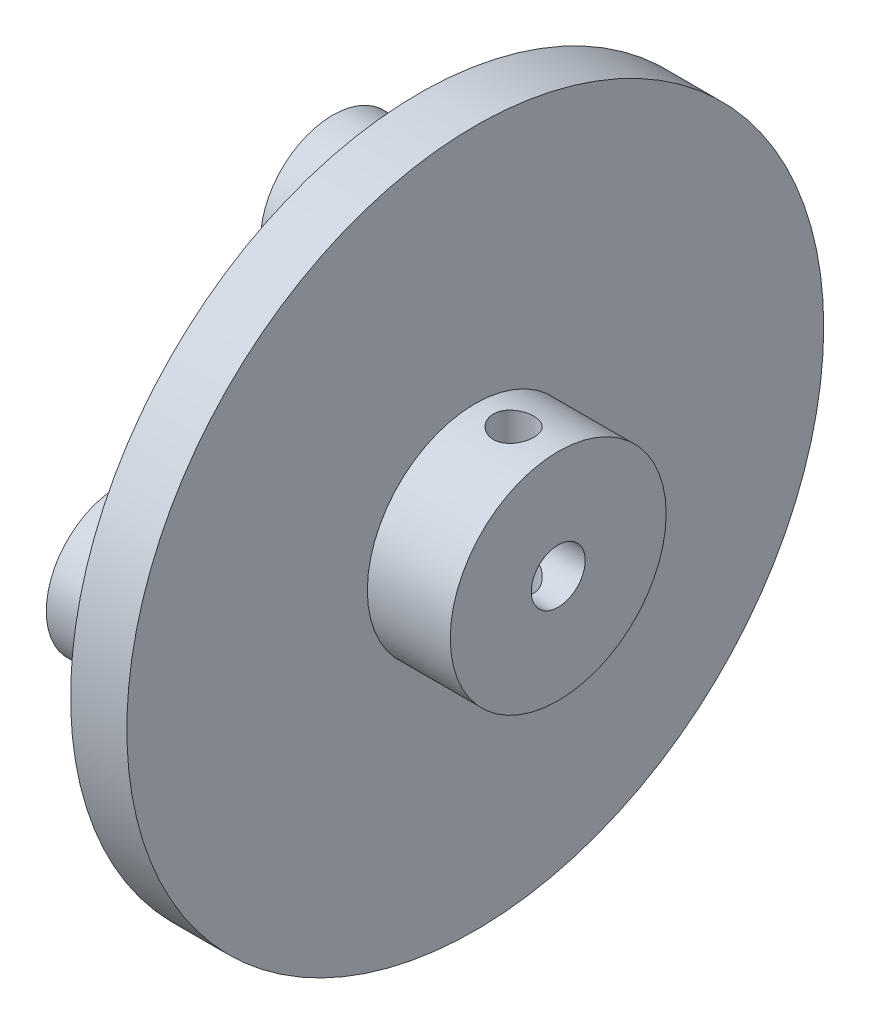
ISO-10303-21;
HEADER;
FILE_DESCRIPTION(('STEP AP214'),'2;1');
FILE_NAME('part.step','',(''),(''),'','','');
FILE_SCHEMA(('AUTOMOTIVE_DESIGN { 1 0 10303 214 1 1 1 1 }'));
ENDSEC;
DATA;
#1=APPLICATION_CONTEXT('core data for automotive mechanical design processes');
#2=APPLICATION_PROTOCOL_DEFINITION('international standard','automotive_design',2000,#1);
#3=PRODUCT_CONTEXT('',#1,'mechanical');
#4=PRODUCT('Part','Part','',(#3));
#5=PRODUCT_RELATED_PRODUCT_CATEGORY('part','',(#4));
#6=PRODUCT_DEFINITION_FORMATION('','',#4);
#7=PRODUCT_DEFINITION_CONTEXT('part definition',#1,'design');
#8=PRODUCT_DEFINITION('design','',#6,#7);
#9=PRODUCT_DEFINITION_SHAPE('','',#8);
#10=(LENGTH_UNIT() NAMED_UNIT(*) SI_UNIT(.MILLI.,.METRE.));
#11=(NAMED_UNIT(*) PLANE_ANGLE_UNIT() SI_UNIT($,.RADIAN.));
#12=(NAMED_UNIT(*) SI_UNIT($,.STERADIAN.) SOLID_ANGLE_UNIT());
#13=UNCERTAINTY_MEASURE_WITH_UNIT(LENGTH_MEASURE(1.E-05),#10,'distance_accuracy_value','');
#14=(GEOMETRIC_REPRESENTATION_CONTEXT(3) GLOBAL_UNCERTAINTY_ASSIGNED_CONTEXT((#13)) GLOBAL_UNIT_ASSIGNED_CONTEXT((#10,
#11,#12)) REPRESENTATION_CONTEXT('',''));
#15=CARTESIAN_POINT('',(0.,0.,0.));
#16=DIRECTION('',(0.,0.,1.));
#17=DIRECTION('',(1.,0.,0.));
#18=AXIS2_PLACEMENT_3D('',#15,#16,#17);
#19=CARTESIAN_POINT('',(-6.42681573579621,0.,0.));
#20=DIRECTION('',(1.,0.,0.));
#21=DIRECTION('',(0.,0.,-1.));
#22=AXIS2_PLACEMENT_3D('',#19,#20,#21);
#23=PLANE('',#22);
#24=CARTESIAN_POINT('',(-6.42681573579621,0.,0.));
#25=DIRECTION('',(1.,0.,0.));
#26=DIRECTION('',(0.,0.,-1.));
#27=AXIS2_PLACEMENT_3D('',#24,#25,#26);
#28=CIRCLE('',#27,4.5);
#29=CARTESIAN_POINT('',(-6.42681573579621,0.,-4.5));
#30=VERTEX_POINT('',#29);
#31=EDGE_CURVE('E127',#30,#30,#28,.T.);
#32=ORIENTED_EDGE('',*,*,#31,.F.);
#33=EDGE_LOOP('',(#32));
#34=FACE_BOUND('',#33,.T.);
#35=CARTESIAN_POINT('',(-6.42681573579621,0.,0.));
#36=DIRECTION('',(1.,0.,0.));
#37=DIRECTION('',(0.,0.,-1.));
#38=AXIS2_PLACEMENT_3D('',#35,#36,#37);
#39=CIRCLE('',#38,1.5875);
#40=CARTESIAN_POINT('',(-6.42681573579621,0.,-1.5875));
#41=VERTEX_POINT('',#40);
#42=EDGE_CURVE('E130',#41,#41,#39,.T.);
#43=ORIENTED_EDGE('',*,*,#42,.T.);
#44=EDGE_LOOP('',(#43));
#45=FACE_BOUND('',#44,.T.);
#46=ADVANCED_FACE('F47',(#34,#45),#23,.F.);
#47=CARTESIAN_POINT('',(0.,0.,0.));
#48=DIRECTION('',(1.,0.,0.));
#49=DIRECTION('',(0.,0.,-1.));
#50=AXIS2_PLACEMENT_3D('',#47,#48,#49);
#51=CYLINDRICAL_SURFACE('',#50,1.5875);
#52=CARTESIAN_POINT('',(-2.62369481915258,-1.05003255157876,1.190625));
#53=CARTESIAN_POINT('',(-2.56813436430848,-1.050045445975,1.19061880120499));
#54=CARTESIAN_POINT('',(-2.51253343816749,-1.05454741000987,1.18668886577821));
#55=CARTESIAN_POINT('',(-2.4035642457863,-1.07148823701036,1.17140301985762));
#56=CARTESIAN_POINT('',(-2.35020314091834,-1.08395075602632,1.16002497361435));
#57=CARTESIAN_POINT('',(-2.24779081580399,-1.11422757784016,1.13096547199778));
#58=CARTESIAN_POINT('',(-2.19869029009737,-1.13196567044321,1.11337314984434));
#59=CARTESIAN_POINT('',(-2.1043081146867,-1.17067373681068,1.0725995764387));
#60=CARTESIAN_POINT('',(-2.05902600431763,-1.1916433198529,1.04941900067592));
#61=CARTESIAN_POINT('',(-1.96320528707628,-1.2396574216291,0.992504284125243));
#62=CARTESIAN_POINT('',(-1.91355214636031,-1.26705442557768,0.957576618231006));
#63=CARTESIAN_POINT('',(-1.82000273032277,-1.321761740015,0.880535424277006));
#64=CARTESIAN_POINT('',(-1.77611510332648,-1.34907186163527,0.838411314369719));
#65=CARTESIAN_POINT('',(-1.6863881953448,-1.40702174808774,0.737878090100433));
#66=CARTESIAN_POINT('',(-1.64198008306869,-1.43720281226121,0.677900035756592));
#67=CARTESIAN_POINT('',(-1.56433844132807,-1.49131980240358,0.548631836139914));
#68=CARTESIAN_POINT('',(-1.53107865803671,-1.51527037067959,0.479364114482457));
#69=CARTESIAN_POINT('',(-1.48608621846711,-1.54808443073509,0.355496037787017));
#70=CARTESIAN_POINT('',(-1.47088637421967,-1.55931958043549,0.30277280194345));
#71=CARTESIAN_POINT('',(-1.44784141458016,-1.57643223525434,0.194907383645005));
#72=CARTESIAN_POINT('',(-1.43998990936785,-1.58231439499439,0.139767346508665));
#73=CARTESIAN_POINT('',(-1.43210006789922,-1.58822529365106,0.0284679172687339));
#74=CARTESIAN_POINT('',(-1.43208203349128,-1.58823882295637,-0.0276937463004202));
#75=CARTESIAN_POINT('',(-1.43991030647193,-1.58237401411808,-0.139157199360017));
#76=CARTESIAN_POINT('',(-1.44775843508592,-1.57649431153499,-0.194458786708893));
#77=CARTESIAN_POINT('',(-1.47044040305828,-1.55965031243376,-0.300743297572917));
#78=CARTESIAN_POINT('',(-1.48502577822232,-1.54886705851508,-0.35180926291256));
#79=CARTESIAN_POINT('',(-1.52037886013472,-1.52306558684007,-0.450596385005578));
#80=CARTESIAN_POINT('',(-1.5411479149349,-1.50804644569141,-0.498316809620449));
#81=CARTESIAN_POINT('',(-1.59065270117417,-1.472890802502,-0.59469093173013));
#82=CARTESIAN_POINT('',(-1.62000754584371,-1.45237629107677,-0.642886211616419));
#83=CARTESIAN_POINT('',(-1.68447719667917,-1.40859432596468,-0.733875255122701));
#84=CARTESIAN_POINT('',(-1.71959691127687,-1.38532453106985,-0.776664360293094));
#85=CARTESIAN_POINT('',(-1.8023408522792,-1.33265676661186,-0.864458871498922));
#86=CARTESIAN_POINT('',(-1.85106587961103,-1.3029537684393,-0.908244413225474));
#87=CARTESIAN_POINT('',(-1.95522601990249,-1.24401229387742,-0.987431949727557));
#88=CARTESIAN_POINT('',(-2.01066431065059,-1.21477404494797,-1.0228299505536));
#89=CARTESIAN_POINT('',(-2.11647417866004,-1.16537919386833,-1.07849357589208));
#90=CARTESIAN_POINT('',(-2.16569078635997,-1.14456844833299,-1.10036663076556));
#91=CARTESIAN_POINT('',(-2.26814663627921,-1.10757288373056,-1.13759771455097));
#92=CARTESIAN_POINT('',(-2.3213764624068,-1.09137763785656,-1.15297046685305));
#93=CARTESIAN_POINT('',(-2.42024633095124,-1.06870540179809,-1.17397518372094));
#94=CARTESIAN_POINT('',(-2.46529969058283,-1.06093847023266,-1.18093386412912));
#95=CARTESIAN_POINT('',(-2.55650822042805,-1.05120748322928,-1.18960709991958));
#96=CARTESIAN_POINT('',(-2.60266190457544,-1.04923600365031,-1.19132836468154));
#97=CARTESIAN_POINT('',(-2.69471876884096,-1.05142402102457,-1.18939683154219));
#98=CARTESIAN_POINT('',(-2.740621850514,-1.05558577464436,-1.1857420555772));
#99=CARTESIAN_POINT('',(-2.8309240151541,-1.06934967402693,-1.17334131022126));
#100=CARTESIAN_POINT('',(-2.87532039377388,-1.0789611050858,-1.16458665082263));
#101=CARTESIAN_POINT('',(-2.9779756423228,-1.10670783140943,-1.13834830402644));
#102=CARTESIAN_POINT('',(-3.03520335757263,-1.12668703809744,-1.11882388129336));
#103=CARTESIAN_POINT('',(-3.14463902716692,-1.1710817723223,-1.07226796784258));
#104=CARTESIAN_POINT('',(-3.19683749850528,-1.19550543916301,-1.04522265503785));
#105=CARTESIAN_POINT('',(-3.29786559429077,-1.24704699135672,-0.983216332051273));
#106=CARTESIAN_POINT('',(-3.34650966465082,-1.27422976552799,-0.948008248603959));
#107=CARTESIAN_POINT('',(-3.43808398313932,-1.32832083103687,-0.870605343134576));
#108=CARTESIAN_POINT('',(-3.48101143699379,-1.3552289822489,-0.828407126793552));
#109=CARTESIAN_POINT('',(-3.56927093125838,-1.41255926707429,-0.727261145352261));
#110=CARTESIAN_POINT('',(-3.61308453999579,-1.44246738243752,-0.666667665064066));
#111=CARTESIAN_POINT('',(-3.6894000263292,-1.49584651911049,-0.536219092541942));
#112=CARTESIAN_POINT('',(-3.72192638616398,-1.519331448665,-0.466384505042537));
#113=CARTESIAN_POINT('',(-3.76545497486353,-1.55114153831889,-0.341912306313172));
#114=CARTESIAN_POINT('',(-3.77999552381496,-1.56190535686026,-0.28912348300368));
#115=CARTESIAN_POINT('',(-3.80172205122167,-1.57805648311366,-0.181264294065453));
#116=CARTESIAN_POINT('',(-3.8089146051317,-1.58344859766149,-0.126196014246041));
#117=CARTESIAN_POINT('',(-3.81552345445215,-1.58840143581668,-0.0151984122151906));
#118=CARTESIAN_POINT('',(-3.81492149542274,-1.58794847048757,0.0407326247410015));
#119=CARTESIAN_POINT('',(-3.80593703230722,-1.58121987574774,0.151613402505127));
#120=CARTESIAN_POINT('',(-3.79755245547226,-1.57494269517078,0.206562877919336));
#121=CARTESIAN_POINT('',(-3.77385847944483,-1.55736449484374,0.312358036108635));
#122=CARTESIAN_POINT('',(-3.75875717522859,-1.54621460816848,0.363276543980958));
#123=CARTESIAN_POINT('',(-3.72241304206754,-1.51973534456514,0.461693691083553));
#124=CARTESIAN_POINT('',(-3.70116889941179,-1.50440507365769,0.509191596064872));
#125=CARTESIAN_POINT('',(-3.65058670618578,-1.46857753504696,0.605272235896158));
#126=CARTESIAN_POINT('',(-3.6206043923859,-1.44769167461642,0.653368356641276));
#127=CARTESIAN_POINT('',(-3.55486958196267,-1.403234954476,0.744073006806096));
#128=CARTESIAN_POINT('',(-3.51911178205677,-1.37966163294053,0.786676427329303));
#129=CARTESIAN_POINT('',(-3.43490305944494,-1.32640667727172,0.874017021494157));
#130=CARTESIAN_POINT('',(-3.38534048959715,-1.29643919738103,0.91750905161459));
#131=CARTESIAN_POINT('',(-3.27943703708205,-1.2371870295527,0.995959824095467));
#132=CARTESIAN_POINT('',(-3.22309368223605,-1.20790259531752,1.03091544004403));
#133=CARTESIAN_POINT('',(-3.11670623899652,-1.15926871150369,1.0850242722053));
#134=CARTESIAN_POINT('',(-3.06792892662924,-1.13913939849812,1.10595986530786));
#135=CARTESIAN_POINT('',(-2.96652900691447,-1.10357098191916,1.14145534685201));
#136=CARTESIAN_POINT('',(-2.91391705144868,-1.08811945745384,1.15603216594685));
#137=CARTESIAN_POINT('',(-2.82150666984751,-1.06785111060464,1.17472664594127));
#138=CARTESIAN_POINT('',(-2.78247095631577,-1.06124478398383,1.18065747665075));
#139=CARTESIAN_POINT('',(-2.70352834230711,-1.05233228217761,1.18860759763756));
#140=CARTESIAN_POINT('',(-2.66362203090349,-1.05002328532472,1.19062945461798));
#141=CARTESIAN_POINT('',(-2.62369481915258,-1.05003255157876,1.190625));
#142=B_SPLINE_CURVE_WITH_KNOTS('',3,(#52,#53,#54,#55,#56,#57,#58,#59,#60,#61,#62,#63,#64,#65,
#66,#67,#68,#69,#70,#71,#72,#73,#74,#75,#76,#77,#78,#79,#80,#81,#82,#83,#84,#85,#86,#87,#88,#89,
#90,#91,#92,#93,#94,#95,#96,#97,#98,#99,#100,#101,#102,#103,#104,#105,#106,#107,#108,#109,#110,
#111,#112,#113,#114,#115,#116,#117,#118,#119,#120,#121,#122,#123,#124,#125,#126,#127,#128,#129,
#130,#131,#132,#133,#134,#135,#136,#137,#138,#139,#140,#141),.UNSPECIFIED.,.T.,.F.,(4,2,2,2,2,2,
2,2,2,2,2,2,2,2,2,2,2,2,2,2,2,2,2,2,2,2,2,2,2,2,2,2,2,2,2,2,2,2,2,2,2,2,2,2,4),(0.,
0.166474597743314,0.333446217300252,0.498114149835985,0.662762187833674,0.861895093986152,
1.0613233713153,1.30147098182183,1.5410490153444,1.70837006939059,1.87554549222377,
2.04315417765197,2.21080167790273,2.37270731241696,2.53464826848756,2.71412370017785,
2.89375274442083,3.10871804281232,3.32378549783047,3.49646406272525,3.66874938249073,
3.80688854402059,3.9448506680219,4.08286356658931,4.22111232464965,4.41110709885653,
4.60145338469826,4.79856172215235,4.99576605498253,5.23599171487224,5.47569301565586,
5.64239486354326,5.80894740496725,5.97589007623953,6.14287722220568,6.30501670074205,
6.46719088019845,6.64773604163628,6.82844793934811,7.0449089208391,7.26144906140521,
7.43123259464913,7.60056126707079,7.72027294583552,7.83990599300724),.UNSPECIFIED.);
#143=CARTESIAN_POINT('',(-2.62369481915258,-1.05003255157876,1.190625));
#144=VERTEX_POINT('',#143);
#145=EDGE_CURVE('E99',#144,#144,#142,.T.);
#146=ORIENTED_EDGE('',*,*,#145,.F.);
#147=EDGE_LOOP('',(#146));
#148=FACE_BOUND('',#147,.T.);
#149=CARTESIAN_POINT('',(-2.62369481915258,1.05003255157876,1.190625));
#150=CARTESIAN_POINT('',(-2.67925527399667,1.050045445975,1.19061880120499));
#151=CARTESIAN_POINT('',(-2.73485620013766,1.05454741000987,1.18668886577821));
#152=CARTESIAN_POINT('',(-2.84382539251885,1.07148823701036,1.17140301985762));
#153=CARTESIAN_POINT('',(-2.89718649738681,1.08395075602632,1.16002497361435));
#154=CARTESIAN_POINT('',(-2.99959882250116,1.11422757784016,1.13096547199778));
#155=CARTESIAN_POINT('',(-3.04869934820778,1.13196567044321,1.11337314984434));
#156=CARTESIAN_POINT('',(-3.14308152361845,1.17067373681068,1.0725995764387));
#157=CARTESIAN_POINT('',(-3.18836363398752,1.1916433198529,1.04941900067592));
#158=CARTESIAN_POINT('',(-3.28418435122887,1.2396574216291,0.992504284125243));
#159=CARTESIAN_POINT('',(-3.33383749194484,1.26705442557768,0.957576618231006));
#160=CARTESIAN_POINT('',(-3.42738690798238,1.321761740015,0.880535424277006));
#161=CARTESIAN_POINT('',(-3.47127453497867,1.34907186163527,0.838411314369719));
#162=CARTESIAN_POINT('',(-3.56100144296035,1.40702174808774,0.737878090100432));
#163=CARTESIAN_POINT('',(-3.60540955523646,1.43720281226121,0.677900035756592));
#164=CARTESIAN_POINT('',(-3.68305119697708,1.49131980240358,0.548631836139914));
#165=CARTESIAN_POINT('',(-3.71631098026844,1.51527037067959,0.479364114482457));
#166=CARTESIAN_POINT('',(-3.76130341983804,1.54808443073509,0.355496037787017));
#167=CARTESIAN_POINT('',(-3.77650326408548,1.55931958043549,0.30277280194345));
#168=CARTESIAN_POINT('',(-3.79954822372499,1.57643223525434,0.194907383645005));
#169=CARTESIAN_POINT('',(-3.8073997289373,1.58231439499439,0.139767346508665));
#170=CARTESIAN_POINT('',(-3.81528957040593,1.58822529365106,0.028467917268734));
#171=CARTESIAN_POINT('',(-3.81530760481387,1.58823882295637,-0.0276937463004201));
#172=CARTESIAN_POINT('',(-3.80747933183322,1.58237401411808,-0.139157199360017));
#173=CARTESIAN_POINT('',(-3.79963120321923,1.57649431153499,-0.194458786708893));
#174=CARTESIAN_POINT('',(-3.77694923524687,1.55965031243376,-0.300743297572917));
#175=CARTESIAN_POINT('',(-3.76236386008283,1.54886705851508,-0.35180926291256));
#176=CARTESIAN_POINT('',(-3.72701077817043,1.52306558684007,-0.450596385005578));
#177=CARTESIAN_POINT('',(-3.70624172337025,1.50804644569141,-0.498316809620449));
#178=CARTESIAN_POINT('',(-3.65673693713098,1.472890802502,-0.59469093173013));
#179=CARTESIAN_POINT('',(-3.62738209246143,1.45237629107677,-0.642886211616419));
#180=CARTESIAN_POINT('',(-3.56291244162598,1.40859432596468,-0.7338752551227));
#181=CARTESIAN_POINT('',(-3.52779272702828,1.38532453106985,-0.776664360293094));
#182=CARTESIAN_POINT('',(-3.44504878602595,1.33265676661186,-0.864458871498922));
#183=CARTESIAN_POINT('',(-3.39632375869412,1.3029537684393,-0.908244413225474));
#184=CARTESIAN_POINT('',(-3.29216361840266,1.24401229387742,-0.987431949727557));
#185=CARTESIAN_POINT('',(-3.23672532765456,1.21477404494797,-1.0228299505536));
#186=CARTESIAN_POINT('',(-3.13091545964511,1.16537919386833,-1.07849357589208));
#187=CARTESIAN_POINT('',(-3.08169885194518,1.14456844833299,-1.10036663076556));
#188=CARTESIAN_POINT('',(-2.97924300202594,1.10757288373056,-1.13759771455097));
#189=CARTESIAN_POINT('',(-2.92601317589835,1.09137763785656,-1.15297046685305));
#190=CARTESIAN_POINT('',(-2.82714330735391,1.06870540179809,-1.17397518372094));
#191=CARTESIAN_POINT('',(-2.78208994772232,1.06093847023266,-1.18093386412912));
#192=CARTESIAN_POINT('',(-2.6908814178771,1.05120748322928,-1.18960709991958));
#193=CARTESIAN_POINT('',(-2.64472773372971,1.04923600365031,-1.19132836468154));
#194=CARTESIAN_POINT('',(-2.55267086946419,1.05142402102457,-1.18939683154219));
#195=CARTESIAN_POINT('',(-2.50676778779115,1.05558577464436,-1.1857420555772));
#196=CARTESIAN_POINT('',(-2.41646562315105,1.06934967402693,-1.17334131022126));
#197=CARTESIAN_POINT('',(-2.37206924453127,1.0789611050858,-1.16458665082263));
#198=CARTESIAN_POINT('',(-2.26941399598235,1.10670783140943,-1.13834830402645));
#199=CARTESIAN_POINT('',(-2.21218628073252,1.12668703809744,-1.11882388129336));
#200=CARTESIAN_POINT('',(-2.10275061113823,1.1710817723223,-1.07226796784258));
#201=CARTESIAN_POINT('',(-2.05055213979987,1.19550543916301,-1.04522265503785));
#202=CARTESIAN_POINT('',(-1.94952404401438,1.24704699135672,-0.983216332051273));
#203=CARTESIAN_POINT('',(-1.90087997365433,1.27422976552799,-0.948008248603959));
#204=CARTESIAN_POINT('',(-1.80930565516584,1.32832083103687,-0.870605343134576));
#205=CARTESIAN_POINT('',(-1.76637820131136,1.3552289822489,-0.828407126793552));
#206=CARTESIAN_POINT('',(-1.67811870704677,1.41255926707429,-0.727261145352261));
#207=CARTESIAN_POINT('',(-1.63430509830936,1.44246738243752,-0.666667665064067));
#208=CARTESIAN_POINT('',(-1.55798961197595,1.49584651911049,-0.536219092541943));
#209=CARTESIAN_POINT('',(-1.52546325214117,1.519331448665,-0.466384505042537));
#210=CARTESIAN_POINT('',(-1.48193466344162,1.55114153831889,-0.341912306313172));
#211=CARTESIAN_POINT('',(-1.46739411449019,1.56190535686026,-0.28912348300368));
#212=CARTESIAN_POINT('',(-1.44566758708348,1.57805648311366,-0.181264294065453));
#213=CARTESIAN_POINT('',(-1.43847503317345,1.58344859766149,-0.126196014246041));
#214=CARTESIAN_POINT('',(-1.431866183853,1.58840143581668,-0.0151984122151906));
#215=CARTESIAN_POINT('',(-1.43246814288241,1.58794847048757,0.0407326247410015));
#216=CARTESIAN_POINT('',(-1.44145260599793,1.58121987574774,0.151613402505127));
#217=CARTESIAN_POINT('',(-1.44983718283289,1.57494269517078,0.206562877919336));
#218=CARTESIAN_POINT('',(-1.47353115886032,1.55736449484374,0.312358036108635));
#219=CARTESIAN_POINT('',(-1.48863246307656,1.54621460816848,0.363276543980958));
#220=CARTESIAN_POINT('',(-1.52497659623761,1.51973534456514,0.461693691083553));
#221=CARTESIAN_POINT('',(-1.54622073889336,1.50440507365769,0.509191596064872));
#222=CARTESIAN_POINT('',(-1.59680293211937,1.46857753504696,0.605272235896158));
#223=CARTESIAN_POINT('',(-1.62678524591925,1.44769167461642,0.653368356641276));
#224=CARTESIAN_POINT('',(-1.69252005634248,1.403234954476,0.744073006806096));
#225=CARTESIAN_POINT('',(-1.72827785624838,1.37966163294053,0.786676427329303));
#226=CARTESIAN_POINT('',(-1.81248657886021,1.32640667727172,0.874017021494157));
#227=CARTESIAN_POINT('',(-1.862049148708,1.29643919738103,0.91750905161459));
#228=CARTESIAN_POINT('',(-1.9679526012231,1.2371870295527,0.995959824095467));
#229=CARTESIAN_POINT('',(-2.0242959560691,1.20790259531752,1.03091544004403));
#230=CARTESIAN_POINT('',(-2.13068339930863,1.15926871150369,1.0850242722053));
#231=CARTESIAN_POINT('',(-2.17946071167591,1.13913939849812,1.10595986530786));
#232=CARTESIAN_POINT('',(-2.28086063139068,1.10357098191916,1.14145534685201));
#233=CARTESIAN_POINT('',(-2.33347258685646,1.08811945745384,1.15603216594685));
#234=CARTESIAN_POINT('',(-2.42588296845764,1.06785111060464,1.17472664594127));
#235=CARTESIAN_POINT('',(-2.46491868198938,1.06124478398383,1.18065747665075));
#236=CARTESIAN_POINT('',(-2.54386129599804,1.05233228217761,1.18860759763756));
#237=CARTESIAN_POINT('',(-2.58376760740166,1.05002328532472,1.19062945461798));
#238=CARTESIAN_POINT('',(-2.62369481915258,1.05003255157876,1.190625));
#239=B_SPLINE_CURVE_WITH_KNOTS('',3,(#149,#150,#151,#152,#153,#154,#155,#156,#157,#158,#159,
#160,#161,#162,#163,#164,#165,#166,#167,#168,#169,#170,#171,#172,#173,#174,#175,#176,#177,#178,
#179,#180,#181,#182,#183,#184,#185,#186,#187,#188,#189,#190,#191,#192,#193,#194,#195,#196,#197,
#198,#199,#200,#201,#202,#203,#204,#205,#206,#207,#208,#209,#210,#211,#212,#213,#214,#215,#216,
#217,#218,#219,#220,#221,#222,#223,#224,#225,#226,#227,#228,#229,#230,#231,#232,#233,#234,#235,
#236,#237,#238),.UNSPECIFIED.,.T.,.F.,(4,2,2,2,2,2,2,2,2,2,2,2,2,2,2,2,2,2,2,2,2,2,2,2,2,2,2,2,
2,2,2,2,2,2,2,2,2,2,2,2,2,2,2,2,4),(0.,0.166474597743314,0.333446217300252,0.498114149835985,
0.662762187833674,0.861895093986153,1.0613233713153,1.30147098182183,1.5410490153444,
1.70837006939059,1.87554549222377,2.04315417765197,2.21080167790273,2.37270731241696,
2.53464826848756,2.71412370017785,2.89375274442083,3.10871804281232,3.32378549783047,
3.49646406272525,3.66874938249073,3.80688854402059,3.94485066802191,4.08286356658931,
4.22111232464965,4.41110709885653,4.60145338469826,4.79856172215235,4.99576605498253,
5.23599171487224,5.47569301565586,5.64239486354326,5.80894740496725,5.97589007623953,
6.14287722220569,6.30501670074205,6.46719088019845,6.64773604163628,6.82844793934812,
7.0449089208391,7.26144906140521,7.43123259464913,7.6005612670708,7.72027294583552,
7.83990599300725),.UNSPECIFIED.);
#240=CARTESIAN_POINT('',(-2.62369481915258,1.05003255157876,1.190625));
#241=VERTEX_POINT('',#240);
#242=EDGE_CURVE('E93',#241,#241,#239,.T.);
#243=ORIENTED_EDGE('',*,*,#242,.F.);
#244=EDGE_LOOP('',(#243));
#245=FACE_BOUND('',#244,.T.);
#246=CARTESIAN_POINT('',(0.,0.,0.));
#247=DIRECTION('',(1.,0.,0.));
#248=DIRECTION('',(0.,0.,-1.));
#249=AXIS2_PLACEMENT_3D('',#246,#247,#248);
#250=CIRCLE('',#249,1.5875);
#251=CARTESIAN_POINT('',(0.,0.,-1.5875));
#252=VERTEX_POINT('',#251);
#253=EDGE_CURVE('E134',#252,#252,#250,.T.);
#254=ORIENTED_EDGE('',*,*,#253,.T.);
#255=EDGE_LOOP('',(#254));
#256=FACE_BOUND('',#255,.T.);
#257=ORIENTED_EDGE('',*,*,#42,.F.);
#258=EDGE_LOOP('',(#257));
#259=FACE_BOUND('',#258,.T.);
#260=ADVANCED_FACE('F104',(#148,#245,#256,#259),#51,.F.);
#261=CARTESIAN_POINT('',(0.,0.,0.));
#262=DIRECTION('',(1.,0.,0.));
#263=DIRECTION('',(0.,0.,-1.));
#264=AXIS2_PLACEMENT_3D('',#261,#262,#263);
#265=PLANE('',#264);
#266=CARTESIAN_POINT('',(0.,0.,0.));
#267=DIRECTION('',(1.,0.,0.));
#268=DIRECTION('',(0.,0.,-1.));
#269=AXIS2_PLACEMENT_3D('',#266,#267,#268);
#270=CIRCLE('',#269,6.35);
#271=CARTESIAN_POINT('',(0.,0.,-6.35));
#272=VERTEX_POINT('',#271);
#273=EDGE_CURVE('E141',#272,#272,#270,.T.);
#274=ORIENTED_EDGE('',*,*,#273,.T.);
#275=EDGE_LOOP('',(#274));
#276=FACE_BOUND('',#275,.T.);
#277=ORIENTED_EDGE('',*,*,#253,.F.);
#278=EDGE_LOOP('',(#277));
#279=FACE_BOUND('',#278,.T.);
#280=ADVANCED_FACE('F107',(#276,#279),#265,.T.);
#281=CARTESIAN_POINT('',(0.,0.,0.));
#282=DIRECTION('',(1.,0.,0.));
#283=DIRECTION('',(0.,0.,-1.));
#284=AXIS2_PLACEMENT_3D('',#281,#282,#283);
#285=CYLINDRICAL_SURFACE('',#284,6.35);
#286=CARTESIAN_POINT('',(-2.62369481915258,-6.23738022805849,1.190625));
#287=CARTESIAN_POINT('',(-2.689938978003,-6.23738151031385,1.19062245907442));
#288=CARTESIAN_POINT('',(-2.75621610302296,-6.23844700897501,1.18507769040044));
#289=CARTESIAN_POINT('',(-2.88690149488208,-6.24258856832369,1.16306007269174));
#290=CARTESIAN_POINT('',(-2.95130812793668,-6.24566633455276,1.14657795328794));
#291=CARTESIAN_POINT('',(-3.07634271956241,-6.25347187545005,1.10320959521414));
#292=CARTESIAN_POINT('',(-3.1369741371677,-6.25819811268953,1.07633304826229));
#293=CARTESIAN_POINT('',(-3.25286358183402,-6.26876624648693,1.01296442822345));
#294=CARTESIAN_POINT('',(-3.30812202773578,-6.27460805597694,0.976473105463744));
#295=CARTESIAN_POINT('',(-3.41238878976756,-6.28683031776661,0.894426701606916));
#296=CARTESIAN_POINT('',(-3.46132052790844,-6.29321605071163,0.848775075156375));
#297=CARTESIAN_POINT('',(-3.55087767839705,-6.30576000771296,0.749912599425359));
#298=CARTESIAN_POINT('',(-3.59150254541471,-6.31191821681104,0.696701254252311));
#299=CARTESIAN_POINT('',(-3.66358619932928,-6.32336982901169,0.583726841315056));
#300=CARTESIAN_POINT('',(-3.69497278638363,-6.32865628516529,0.523916941776878));
#301=CARTESIAN_POINT('',(-3.74722376833218,-6.33770964352422,0.399757331080296));
#302=CARTESIAN_POINT('',(-3.76808902831981,-6.34147667065624,0.335407993663484));
#303=CARTESIAN_POINT('',(-3.79846827336267,-6.3470294312949,0.204789679786261));
#304=CARTESIAN_POINT('',(-3.80811134947871,-6.34883767993707,0.138551700325605));
#305=CARTESIAN_POINT('',(-3.81617472376477,-6.3503467466363,0.0053750178530858));
#306=CARTESIAN_POINT('',(-3.81459597758795,-6.35004774414741,-0.0615636250053379));
#307=CARTESIAN_POINT('',(-3.80035952580452,-6.34739359299572,-0.193356196582646));
#308=CARTESIAN_POINT('',(-3.7878408196675,-6.34506424221226,-0.258225734858354));
#309=CARTESIAN_POINT('',(-3.75229964744511,-6.33864005902264,-0.384926812786658));
#310=CARTESIAN_POINT('',(-3.72927679855934,-6.33454516227535,-0.446758241631066));
#311=CARTESIAN_POINT('',(-3.67324843262505,-6.32500687861013,-0.56603111469027));
#312=CARTESIAN_POINT('',(-3.64018735062203,-6.31955601712718,-0.623445835146835));
#313=CARTESIAN_POINT('',(-3.56506194432258,-6.30790860862137,-0.731964481914119));
#314=CARTESIAN_POINT('',(-3.52299670443556,-6.30171198579361,-0.783067765610435));
#315=CARTESIAN_POINT('',(-3.4302911049094,-6.2891472648395,-0.878336460056673));
#316=CARTESIAN_POINT('',(-3.3795291406803,-6.28277799434412,-0.922383464134014));
#317=CARTESIAN_POINT('',(-3.27127612870017,-6.27067666458918,-1.00135667656938));
#318=CARTESIAN_POINT('',(-3.2137849825019,-6.26494461465447,-1.03628275146501));
#319=CARTESIAN_POINT('',(-3.09354856678234,-6.25476502812528,-1.09605645203179));
#320=CARTESIAN_POINT('',(-3.0307945437575,-6.25031968858395,-1.12088686831053));
#321=CARTESIAN_POINT('',(-2.90190325425478,-6.24325048652372,-1.15961840223951));
#322=CARTESIAN_POINT('',(-2.83576637203365,-6.24062641761904,-1.17352075827755));
#323=CARTESIAN_POINT('',(-2.70305447687322,-6.23753769238923,-1.1898286516573));
#324=CARTESIAN_POINT('',(-2.63650108992245,-6.23704108679058,-1.192404304019));
#325=CARTESIAN_POINT('',(-2.50391520167715,-6.23817801940292,-1.18644169049869));
#326=CARTESIAN_POINT('',(-2.43788267478503,-6.23981145226898,-1.17790397424856));
#327=CARTESIAN_POINT('',(-2.30877220235315,-6.24499465425169,-1.15010301630482));
#328=CARTESIAN_POINT('',(-2.24567435613156,-6.24852848185885,-1.13092895626042));
#329=CARTESIAN_POINT('',(-2.12358692480426,-6.25710056486816,-1.08249421850879));
#330=CARTESIAN_POINT('',(-2.06459764287103,-6.26213893114604,-1.05323279739731));
#331=CARTESIAN_POINT('',(-1.95165239653706,-6.273225149293,-0.985062427887302));
#332=CARTESIAN_POINT('',(-1.89776239222138,-6.27928398243844,-0.946046015889492));
#333=CARTESIAN_POINT('',(-1.79723276223245,-6.2916975652343,-0.859618108232458));
#334=CARTESIAN_POINT('',(-1.75059378916768,-6.29805234145342,-0.812205857750102));
#335=CARTESIAN_POINT('',(-1.66525458184736,-6.31044445304719,-0.709572350434619));
#336=CARTESIAN_POINT('',(-1.62666875678409,-6.31647641192686,-0.654255211438614));
#337=CARTESIAN_POINT('',(-1.55933861174905,-6.32745277568216,-0.537824777663112));
#338=CARTESIAN_POINT('',(-1.53059391288273,-6.33239722242563,-0.476711706149333));
#339=CARTESIAN_POINT('',(-1.48393324147296,-6.34061833534204,-0.350740298628081));
#340=CARTESIAN_POINT('',(-1.46596108277571,-6.3439036406705,-0.285903362881447));
#341=CARTESIAN_POINT('',(-1.44117634957248,-6.34847315903972,-0.154063880484122));
#342=CARTESIAN_POINT('',(-1.43436260083905,-6.34975758263759,-0.0870615624588323));
#343=CARTESIAN_POINT('',(-1.43212898607231,-6.35017643090381,0.0461095409488416));
#344=CARTESIAN_POINT('',(-1.43653632135601,-6.34934346258619,0.11227538748385));
#345=CARTESIAN_POINT('',(-1.45624130869377,-6.34568887873039,0.242906049365365));
#346=CARTESIAN_POINT('',(-1.47153885634329,-6.3428672822572,0.307370881013366));
#347=CARTESIAN_POINT('',(-1.5125172150134,-6.33555246395074,0.432678265003916));
#348=CARTESIAN_POINT('',(-1.53817963312687,-6.33106220435378,0.49352701595884));
#349=CARTESIAN_POINT('',(-1.59913855424138,-6.32089614079585,0.610080719857626));
#350=CARTESIAN_POINT('',(-1.63443570269973,-6.31522025741262,0.665785327846346));
#351=CARTESIAN_POINT('',(-1.71425691111617,-6.30320669013837,0.77133055330038));
#352=CARTESIAN_POINT('',(-1.7589058085303,-6.29686069644355,0.821075824341234));
#353=CARTESIAN_POINT('',(-1.85590406563117,-6.28427459121416,0.912427817519787));
#354=CARTESIAN_POINT('',(-1.90825523401174,-6.27803450493435,0.954032622702936));
#355=CARTESIAN_POINT('',(-2.01975144257333,-6.26630364581951,1.0282843444415));
#356=CARTESIAN_POINT('',(-2.07895486188866,-6.26082034029538,1.06084481547176));
#357=CARTESIAN_POINT('',(-2.20207528994909,-6.25131373440504,1.11550555111084));
#358=CARTESIAN_POINT('',(-2.26598778325827,-6.24728905676022,1.13761568925877));
#359=CARTESIAN_POINT('',(-2.37902319780462,-6.24199456683126,1.16625470485721));
#360=CARTESIAN_POINT('',(-2.42748436238774,-6.24027446636446,1.1753779018103));
#361=CARTESIAN_POINT('',(-2.52518922846208,-6.23796683562345,1.18756391166722));
#362=CARTESIAN_POINT('',(-2.57443290861546,-6.2373792745201,1.1906268895379));
#363=CARTESIAN_POINT('',(-2.62369481915258,-6.23738022805849,1.190625));
#364=B_SPLINE_CURVE_WITH_KNOTS('',3,(#286,#287,#288,#289,#290,#291,#292,#293,#294,#295,#296,
#297,#298,#299,#300,#301,#302,#303,#304,#305,#306,#307,#308,#309,#310,#311,#312,#313,#314,#315,
#316,#317,#318,#319,#320,#321,#322,#323,#324,#325,#326,#327,#328,#329,#330,#331,#332,#333,#334,
#335,#336,#337,#338,#339,#340,#341,#342,#343,#344,#345,#346,#347,#348,#349,#350,#351,#352,#353,
#354,#355,#356,#357,#358,#359,#360,#361,#362,#363),.UNSPECIFIED.,.T.,.F.,(4,2,2,2,2,2,2,2,2,2,2,
2,2,2,2,2,2,2,2,2,2,2,2,2,2,2,2,2,2,2,2,2,2,2,2,2,2,2,4),(0.,0.198552201459807,
0.397272908738174,0.595808774681619,0.794329151675382,0.995063539582096,1.19581110108642,
1.39808826573636,1.60034879586963,1.80025893643956,2.00015205281638,2.19754172660111,
2.39493859439311,2.59344868009848,2.79197896096103,2.9935536296635,3.19513124775091,
3.39705105541248,3.59894797785148,3.79780203563365,3.99664625909981,4.19384791397697,
4.39106410505425,4.590556784791,4.79006740891898,4.99224399609721,5.19441279837102,
5.39551776348454,5.59660156445817,5.79460757324921,5.99261168378094,6.19026596055845,
6.3879334819958,6.58843030804315,6.78897429133668,6.99137382690505,7.19358174998237,
7.341237440971,7.48888911252961),.UNSPECIFIED.);
#365=CARTESIAN_POINT('',(-2.62369481915258,-6.23738022805849,1.190625));
#366=VERTEX_POINT('',#365);
#367=EDGE_CURVE('E50',#366,#366,#364,.T.);
#368=ORIENTED_EDGE('',*,*,#367,.F.);
#369=EDGE_LOOP('',(#368));
#370=FACE_BOUND('',#369,.T.);
#371=CARTESIAN_POINT('',(-2.62369481915258,6.23738022805849,1.190625));
#372=CARTESIAN_POINT('',(-2.55745066030215,6.23738151031385,1.19062245907442));
#373=CARTESIAN_POINT('',(-2.49117353528219,6.23844700897501,1.18507769040044));
#374=CARTESIAN_POINT('',(-2.36048814342307,6.24258856832369,1.16306007269174));
#375=CARTESIAN_POINT('',(-2.29608151036847,6.24566633455276,1.14657795328794));
#376=CARTESIAN_POINT('',(-2.17104691874274,6.25347187545005,1.10320959521414));
#377=CARTESIAN_POINT('',(-2.11041550113745,6.25819811268953,1.07633304826229));
#378=CARTESIAN_POINT('',(-1.99452605647113,6.26876624648693,1.01296442822345));
#379=CARTESIAN_POINT('',(-1.93926761056937,6.27460805597694,0.976473105463744));
#380=CARTESIAN_POINT('',(-1.83500084853759,6.28683031776661,0.894426701606916));
#381=CARTESIAN_POINT('',(-1.78606911039671,6.29321605071163,0.848775075156375));
#382=CARTESIAN_POINT('',(-1.6965119599081,6.30576000771296,0.749912599425359));
#383=CARTESIAN_POINT('',(-1.65588709289044,6.31191821681104,0.69670125425231));
#384=CARTESIAN_POINT('',(-1.58380343897587,6.32336982901169,0.583726841315055));
#385=CARTESIAN_POINT('',(-1.55241685192152,6.32865628516529,0.523916941776878));
#386=CARTESIAN_POINT('',(-1.50016586997297,6.33770964352422,0.399757331080295));
#387=CARTESIAN_POINT('',(-1.47930060998534,6.34147667065624,0.335407993663483));
#388=CARTESIAN_POINT('',(-1.44892136494248,6.3470294312949,0.20478967978626));
#389=CARTESIAN_POINT('',(-1.43927828882644,6.34883767993707,0.138551700325605));
#390=CARTESIAN_POINT('',(-1.43121491454038,6.3503467466363,0.00537501785308539));
#391=CARTESIAN_POINT('',(-1.4327936607172,6.35004774414741,-0.0615636250053382));
#392=CARTESIAN_POINT('',(-1.44703011250063,6.34739359299572,-0.193356196582646));
#393=CARTESIAN_POINT('',(-1.45954881863765,6.34506424221226,-0.258225734858354));
#394=CARTESIAN_POINT('',(-1.49508999086004,6.33864005902264,-0.384926812786659));
#395=CARTESIAN_POINT('',(-1.51811283974581,6.33454516227535,-0.446758241631067));
#396=CARTESIAN_POINT('',(-1.5741412056801,6.32500687861013,-0.56603111469027));
#397=CARTESIAN_POINT('',(-1.60720228768312,6.31955601712718,-0.623445835146835));
#398=CARTESIAN_POINT('',(-1.68232769398257,6.30790860862137,-0.731964481914119));
#399=CARTESIAN_POINT('',(-1.72439293386959,6.30171198579361,-0.783067765610435));
#400=CARTESIAN_POINT('',(-1.81709853339575,6.2891472648395,-0.878336460056674));
#401=CARTESIAN_POINT('',(-1.86786049762485,6.28277799434412,-0.922383464134014));
#402=CARTESIAN_POINT('',(-1.97611350960498,6.27067666458918,-1.00135667656938));
#403=CARTESIAN_POINT('',(-2.03360465580325,6.26494461465447,-1.03628275146501));
#404=CARTESIAN_POINT('',(-2.15384107152281,6.25476502812528,-1.09605645203179));
#405=CARTESIAN_POINT('',(-2.21659509454765,6.25031968858395,-1.12088686831053));
#406=CARTESIAN_POINT('',(-2.34548638405037,6.24325048652372,-1.15961840223951));
#407=CARTESIAN_POINT('',(-2.4116232662715,6.24062641761904,-1.17352075827755));
#408=CARTESIAN_POINT('',(-2.54433516143193,6.23753769238923,-1.1898286516573));
#409=CARTESIAN_POINT('',(-2.6108885483827,6.23704108679058,-1.192404304019));
#410=CARTESIAN_POINT('',(-2.743474436628,6.23817801940292,-1.18644169049869));
#411=CARTESIAN_POINT('',(-2.80950696352012,6.23981145226898,-1.17790397424856));
#412=CARTESIAN_POINT('',(-2.938617435952,6.24499465425169,-1.15010301630482));
#413=CARTESIAN_POINT('',(-3.00171528217359,6.24852848185885,-1.13092895626042));
#414=CARTESIAN_POINT('',(-3.12380271350089,6.25710056486816,-1.08249421850879));
#415=CARTESIAN_POINT('',(-3.18279199543412,6.26213893114604,-1.05323279739731));
#416=CARTESIAN_POINT('',(-3.29573724176809,6.273225149293,-0.985062427887301));
#417=CARTESIAN_POINT('',(-3.34962724608377,6.27928398243844,-0.946046015889492));
#418=CARTESIAN_POINT('',(-3.4501568760727,6.2916975652343,-0.859618108232457));
#419=CARTESIAN_POINT('',(-3.49679584913747,6.29805234145342,-0.812205857750101));
#420=CARTESIAN_POINT('',(-3.58213505645779,6.31044445304719,-0.709572350434618));
#421=CARTESIAN_POINT('',(-3.62072088152106,6.31647641192686,-0.654255211438612));
#422=CARTESIAN_POINT('',(-3.6880510265561,6.32745277568216,-0.537824777663111));
#423=CARTESIAN_POINT('',(-3.71679572542242,6.33239722242563,-0.476711706149332));
#424=CARTESIAN_POINT('',(-3.76345639683219,6.34061833534204,-0.35074029862808));
#425=CARTESIAN_POINT('',(-3.78142855552944,6.3439036406705,-0.285903362881446));
#426=CARTESIAN_POINT('',(-3.80621328873267,6.34847315903972,-0.154063880484121));
#427=CARTESIAN_POINT('',(-3.8130270374661,6.34975758263759,-0.0870615624588314));
#428=CARTESIAN_POINT('',(-3.81526065223284,6.35017643090381,0.0461095409488419));
#429=CARTESIAN_POINT('',(-3.81085331694914,6.34934346258619,0.112275387483851));
#430=CARTESIAN_POINT('',(-3.79114832961138,6.34568887873039,0.242906049365365));
#431=CARTESIAN_POINT('',(-3.77585078196186,6.3428672822572,0.307370881013366));
#432=CARTESIAN_POINT('',(-3.73487242329175,6.33555246395074,0.432678265003916));
#433=CARTESIAN_POINT('',(-3.70921000517828,6.33106220435378,0.493527015958841));
#434=CARTESIAN_POINT('',(-3.64825108406377,6.32089614079585,0.610080719857626));
#435=CARTESIAN_POINT('',(-3.61295393560542,6.31522025741262,0.665785327846346));
#436=CARTESIAN_POINT('',(-3.53313272718898,6.30320669013837,0.771330553300381));
#437=CARTESIAN_POINT('',(-3.48848382977485,6.29686069644355,0.821075824341235));
#438=CARTESIAN_POINT('',(-3.39148557267398,6.28427459121416,0.912427817519787));
#439=CARTESIAN_POINT('',(-3.33913440429341,6.27803450493435,0.954032622702936));
#440=CARTESIAN_POINT('',(-3.22763819573182,6.26630364581951,1.0282843444415));
#441=CARTESIAN_POINT('',(-3.16843477641649,6.26082034029538,1.06084481547176));
#442=CARTESIAN_POINT('',(-3.04531434835606,6.25131373440504,1.11550555111084));
#443=CARTESIAN_POINT('',(-2.98140185504688,6.24728905676022,1.13761568925877));
#444=CARTESIAN_POINT('',(-2.86836644050053,6.24199456683126,1.16625470485721));
#445=CARTESIAN_POINT('',(-2.81990527591741,6.24027446636446,1.1753779018103));
#446=CARTESIAN_POINT('',(-2.72220040984307,6.23796683562345,1.18756391166722));
#447=CARTESIAN_POINT('',(-2.67295672968969,6.2373792745201,1.1906268895379));
#448=CARTESIAN_POINT('',(-2.62369481915258,6.23738022805849,1.190625));
#449=B_SPLINE_CURVE_WITH_KNOTS('',3,(#371,#372,#373,#374,#375,#376,#377,#378,#379,#380,#381,
#382,#383,#384,#385,#386,#387,#388,#389,#390,#391,#392,#393,#394,#395,#396,#397,#398,#399,#400,
#401,#402,#403,#404,#405,#406,#407,#408,#409,#410,#411,#412,#413,#414,#415,#416,#417,#418,#419,
#420,#421,#422,#423,#424,#425,#426,#427,#428,#429,#430,#431,#432,#433,#434,#435,#436,#437,#438,
#439,#440,#441,#442,#443,#444,#445,#446,#447,#448),.UNSPECIFIED.,.T.,.F.,(4,2,2,2,2,2,2,2,2,2,2,
2,2,2,2,2,2,2,2,2,2,2,2,2,2,2,2,2,2,2,2,2,2,2,2,2,2,2,4),(0.,0.198552201459807,
0.397272908738174,0.595808774681619,0.794329151675382,0.995063539582097,1.19581110108642,
1.39808826573636,1.60034879586963,1.80025893643956,2.00015205281638,2.19754172660111,
2.39493859439311,2.59344868009848,2.79197896096103,2.9935536296635,3.19513124775091,
3.39705105541248,3.59894797785148,3.79780203563365,3.99664625909981,4.19384791397698,
4.39106410505426,4.590556784791,4.79006740891899,4.99224399609721,5.19441279837102,
5.39551776348454,5.59660156445817,5.79460757324921,5.99261168378094,6.19026596055845,
6.3879334819958,6.58843030804315,6.78897429133668,6.99137382690505,7.19358174998237,
7.341237440971,7.48888911252961),.UNSPECIFIED.);
#450=CARTESIAN_POINT('',(-2.62369481915258,6.23738022805849,1.190625));
#451=VERTEX_POINT('',#450);
#452=EDGE_CURVE('E69',#451,#451,#449,.T.);
#453=ORIENTED_EDGE('',*,*,#452,.F.);
#454=EDGE_LOOP('',(#453));
#455=FACE_BOUND('',#454,.T.);
#456=CARTESIAN_POINT('',(-4.87911158009766,0.,0.));
#457=DIRECTION('',(1.,0.,0.));
#458=DIRECTION('',(0.,0.,-1.));
#459=AXIS2_PLACEMENT_3D('',#456,#457,#458);
#460=CIRCLE('',#459,6.35);
#461=CARTESIAN_POINT('',(-4.87911158009766,0.,-6.35));
#462=VERTEX_POINT('',#461);
#463=EDGE_CURVE('E180',#462,#462,#460,.T.);
#464=ORIENTED_EDGE('',*,*,#463,.T.);
#465=EDGE_LOOP('',(#464));
#466=FACE_BOUND('',#465,.T.);
#467=ORIENTED_EDGE('',*,*,#273,.F.);
#468=EDGE_LOOP('',(#467));
#469=FACE_BOUND('',#468,.T.);
#470=ADVANCED_FACE('F75',(#370,#455,#466,#469),#285,.T.);
#471=CARTESIAN_POINT('',(-4.87911158009766,0.,0.));
#472=DIRECTION('',(1.,0.,0.));
#473=DIRECTION('',(0.,0.,-1.));
#474=AXIS2_PLACEMENT_3D('',#471,#472,#473);
#475=PLANE('',#474);
#476=CARTESIAN_POINT('',(-4.87911158009766,0.,0.));
#477=DIRECTION('',(1.,0.,0.));
#478=DIRECTION('',(0.,0.,-1.));
#479=AXIS2_PLACEMENT_3D('',#476,#477,#478);
#480=CIRCLE('',#479,20.5);
#481=CARTESIAN_POINT('',(-4.87911158009766,0.,-20.5));
#482=VERTEX_POINT('',#481);
#483=EDGE_CURVE('E171',#482,#482,#480,.T.);
#484=ORIENTED_EDGE('',*,*,#483,.T.);
#485=EDGE_LOOP('',(#484));
#486=FACE_BOUND('',#485,.T.);
#487=ORIENTED_EDGE('',*,*,#463,.F.);
#488=EDGE_LOOP('',(#487));
#489=FACE_BOUND('',#488,.T.);
#490=ADVANCED_FACE('F117',(#486,#489),#475,.T.);
#491=CARTESIAN_POINT('',(0.,0.,0.));
#492=DIRECTION('',(1.,0.,0.));
#493=DIRECTION('',(0.,0.,-1.));
#494=AXIS2_PLACEMENT_3D('',#491,#492,#493);
#495=CYLINDRICAL_SURFACE('',#494,20.5);
#496=CARTESIAN_POINT('',(-8.1873872368468,0.,0.));
#497=DIRECTION('',(1.,0.,0.));
#498=DIRECTION('',(0.,0.,-1.));
#499=AXIS2_PLACEMENT_3D('',#496,#497,#498);
#500=CIRCLE('',#499,20.5);
#501=CARTESIAN_POINT('',(-8.1873872368468,0.,-20.5));
#502=VERTEX_POINT('',#501);
#503=EDGE_CURVE('E162',#502,#502,#500,.T.);
#504=ORIENTED_EDGE('',*,*,#503,.T.);
#505=EDGE_LOOP('',(#504));
#506=FACE_BOUND('',#505,.T.);
#507=ORIENTED_EDGE('',*,*,#483,.F.);
#508=EDGE_LOOP('',(#507));
#509=FACE_BOUND('',#508,.T.);
#510=ADVANCED_FACE('F154',(#506,#509),#495,.T.);
#511=CARTESIAN_POINT('',(-8.1873872368468,0.,0.));
#512=DIRECTION('',(1.,0.,0.));
#513=DIRECTION('',(0.,0.,-1.));
#514=AXIS2_PLACEMENT_3D('',#511,#512,#513);
#515=PLANE('',#514);
#516=CARTESIAN_POINT('',(-8.1873872368468,1.3197799460827E-13,-12.6));
#517=DIRECTION('',(1.,0.,0.));
#518=DIRECTION('',(0.,0.,-1.));
#519=AXIS2_PLACEMENT_3D('',#516,#517,#518);
#520=CIRCLE('',#519,4.25);
#521=CARTESIAN_POINT('',(-8.1873872368468,1.3197799460827E-13,-16.85));
#522=VERTEX_POINT('',#521);
#523=EDGE_CURVE('E10',#522,#522,#520,.F.);
#524=ORIENTED_EDGE('',*,*,#523,.F.);
#525=EDGE_LOOP('',(#524));
#526=FACE_BOUND('',#525,.T.);
#527=CARTESIAN_POINT('',(-8.1873872368468,-12.6,0.));
#528=DIRECTION('',(1.,0.,0.));
#529=DIRECTION('',(0.,0.,-1.));
#530=AXIS2_PLACEMENT_3D('',#527,#528,#529);
#531=CIRCLE('',#530,4.25);
#532=CARTESIAN_POINT('',(-8.1873872368468,-12.6,-4.25000000000009));
#533=VERTEX_POINT('',#532);
#534=EDGE_CURVE('E60',#533,#533,#531,.F.);
#535=ORIENTED_EDGE('',*,*,#534,.F.);
#536=EDGE_LOOP('',(#535));
#537=FACE_BOUND('',#536,.T.);
#538=CARTESIAN_POINT('',(-8.1873872368468,0.,12.6));
#539=DIRECTION('',(1.,0.,0.));
#540=DIRECTION('',(0.,0.,-1.));
#541=AXIS2_PLACEMENT_3D('',#538,#539,#540);
#542=CIRCLE('',#541,4.25);
#543=CARTESIAN_POINT('',(-8.1873872368468,0.,8.35));
#544=VERTEX_POINT('',#543);
#545=EDGE_CURVE('E66',#544,#544,#542,.F.);
#546=ORIENTED_EDGE('',*,*,#545,.F.);
#547=EDGE_LOOP('',(#546));
#548=FACE_BOUND('',#547,.T.);
#549=CARTESIAN_POINT('',(-8.1873872368468,12.6,0.));
#550=DIRECTION('',(1.,0.,0.));
#551=DIRECTION('',(0.,0.,-1.));
#552=AXIS2_PLACEMENT_3D('',#549,#550,#551);
#553=CIRCLE('',#552,4.25);
#554=CARTESIAN_POINT('',(-8.1873872368468,12.6,-4.25));
#555=VERTEX_POINT('',#554);
#556=EDGE_CURVE('E133',#555,#555,#553,.F.);
#557=ORIENTED_EDGE('',*,*,#556,.F.);
#558=EDGE_LOOP('',(#557));
#559=FACE_BOUND('',#558,.T.);
#560=ORIENTED_EDGE('',*,*,#503,.F.);
#561=EDGE_LOOP('',(#560));
#562=FACE_BOUND('',#561,.T.);
#563=CARTESIAN_POINT('',(-8.1873872368468,0.,0.));
#564=DIRECTION('',(1.,0.,0.));
#565=DIRECTION('',(0.,0.,-1.));
#566=AXIS2_PLACEMENT_3D('',#563,#564,#565);
#567=CIRCLE('',#566,4.5);
#568=CARTESIAN_POINT('',(-8.1873872368468,0.,-4.5));
#569=VERTEX_POINT('',#568);
#570=EDGE_CURVE('E165',#569,#569,#567,.T.);
#571=ORIENTED_EDGE('',*,*,#570,.T.);
#572=EDGE_LOOP('',(#571));
#573=FACE_BOUND('',#572,.T.);
#574=ADVANCED_FACE('F150',(#526,#537,#548,#559,#562,#573),#515,.F.);
#575=CARTESIAN_POINT('',(0.,0.,0.));
#576=DIRECTION('',(1.,0.,0.));
#577=DIRECTION('',(0.,0.,-1.));
#578=AXIS2_PLACEMENT_3D('',#575,#576,#577);
#579=CYLINDRICAL_SURFACE('',#578,4.5);
#580=ORIENTED_EDGE('',*,*,#31,.T.);
#581=EDGE_LOOP('',(#580));
#582=FACE_BOUND('',#581,.T.);
#583=ORIENTED_EDGE('',*,*,#570,.F.);
#584=EDGE_LOOP('',(#583));
#585=FACE_BOUND('',#584,.T.);
#586=ADVANCED_FACE('F153',(#582,#585),#579,.F.);
#587=CARTESIAN_POINT('',(-13.2673872368468,12.6,0.));
#588=DIRECTION('',(1.,0.,0.));
#589=DIRECTION('',(0.,0.,-1.));
#590=AXIS2_PLACEMENT_3D('',#587,#588,#589);
#591=CYLINDRICAL_SURFACE('',#590,4.25);
#592=CARTESIAN_POINT('',(-13.2673872368468,12.6,0.));
#593=DIRECTION('',(-1.,0.,0.));
#594=DIRECTION('',(0.,0.,1.));
#595=AXIS2_PLACEMENT_3D('',#592,#593,#594);
#596=CIRCLE('',#595,4.25);
#597=CARTESIAN_POINT('',(-13.2673872368468,12.6,4.25));
#598=VERTEX_POINT('',#597);
#599=EDGE_CURVE('E173',#598,#598,#596,.T.);
#600=ORIENTED_EDGE('',*,*,#599,.F.);
#601=EDGE_LOOP('',(#600));
#602=FACE_BOUND('',#601,.T.);
#603=ORIENTED_EDGE('',*,*,#556,.T.);
#604=EDGE_LOOP('',(#603));
#605=FACE_BOUND('',#604,.T.);
#606=ADVANCED_FACE('F198',(#602,#605),#591,.T.);
#607=CARTESIAN_POINT('',(-13.2673872368468,12.6,0.));
#608=DIRECTION('',(-1.,0.,0.));
#609=DIRECTION('',(0.,0.,1.));
#610=AXIS2_PLACEMENT_3D('',#607,#608,#609);
#611=PLANE('',#610);
#612=ORIENTED_EDGE('',*,*,#599,.T.);
#613=EDGE_LOOP('',(#612));
#614=FACE_BOUND('',#613,.T.);
#615=ADVANCED_FACE('F202',(#614),#611,.T.);
#616=CARTESIAN_POINT('',(-13.2673872368468,0.,12.6));
#617=DIRECTION('',(1.,0.,0.));
#618=DIRECTION('',(0.,0.,-1.));
#619=AXIS2_PLACEMENT_3D('',#616,#617,#618);
#620=CYLINDRICAL_SURFACE('',#619,4.25);
#621=CARTESIAN_POINT('',(-13.2673872368468,0.,12.6));
#622=DIRECTION('',(-1.,0.,0.));
#623=DIRECTION('',(0.,0.,1.));
#624=AXIS2_PLACEMENT_3D('',#621,#622,#623);
#625=CIRCLE('',#624,4.25);
#626=CARTESIAN_POINT('',(-13.2673872368468,0.,16.85));
#627=VERTEX_POINT('',#626);
#628=EDGE_CURVE('E235',#627,#627,#625,.T.);
#629=ORIENTED_EDGE('',*,*,#628,.F.);
#630=EDGE_LOOP('',(#629));
#631=FACE_BOUND('',#630,.T.);
#632=ORIENTED_EDGE('',*,*,#545,.T.);
#633=EDGE_LOOP('',(#632));
#634=FACE_BOUND('',#633,.T.);
#635=ADVANCED_FACE('F148',(#631,#634),#620,.T.);
#636=CARTESIAN_POINT('',(-13.2673872368468,0.,12.6));
#637=DIRECTION('',(-1.,0.,0.));
#638=DIRECTION('',(0.,0.,1.));
#639=AXIS2_PLACEMENT_3D('',#636,#637,#638);
#640=PLANE('',#639);
#641=ORIENTED_EDGE('',*,*,#628,.T.);
#642=EDGE_LOOP('',(#641));
#643=FACE_BOUND('',#642,.T.);
#644=ADVANCED_FACE('F207',(#643),#640,.T.);
#645=CARTESIAN_POINT('',(-13.2673872368468,-12.6,0.));
#646=DIRECTION('',(1.,0.,0.));
#647=DIRECTION('',(0.,0.,-1.));
#648=AXIS2_PLACEMENT_3D('',#645,#646,#647);
#649=CYLINDRICAL_SURFACE('',#648,4.25);
#650=CARTESIAN_POINT('',(-13.2673872368468,-12.6,0.));
#651=DIRECTION('',(-1.,0.,0.));
#652=DIRECTION('',(0.,0.,1.));
#653=AXIS2_PLACEMENT_3D('',#650,#651,#652);
#654=CIRCLE('',#653,4.25);
#655=CARTESIAN_POINT('',(-13.2673872368468,-12.6,4.24999999999991));
#656=VERTEX_POINT('',#655);
#657=EDGE_CURVE('E231',#656,#656,#654,.T.);
#658=ORIENTED_EDGE('',*,*,#657,.F.);
#659=EDGE_LOOP('',(#658));
#660=FACE_BOUND('',#659,.T.);
#661=ORIENTED_EDGE('',*,*,#534,.T.);
#662=EDGE_LOOP('',(#661));
#663=FACE_BOUND('',#662,.T.);
#664=ADVANCED_FACE('F210',(#660,#663),#649,.T.);
#665=CARTESIAN_POINT('',(-13.2673872368468,-12.6,0.));
#666=DIRECTION('',(-1.,0.,0.));
#667=DIRECTION('',(0.,0.,1.));
#668=AXIS2_PLACEMENT_3D('',#665,#666,#667);
#669=PLANE('',#668);
#670=ORIENTED_EDGE('',*,*,#657,.T.);
#671=EDGE_LOOP('',(#670));
#672=FACE_BOUND('',#671,.T.);
#673=ADVANCED_FACE('F215',(#672),#669,.T.);
#674=CARTESIAN_POINT('',(-13.2673872368468,1.3197799460827E-13,-12.6));
#675=DIRECTION('',(1.,0.,0.));
#676=DIRECTION('',(0.,0.,-1.));
#677=AXIS2_PLACEMENT_3D('',#674,#675,#676);
#678=CYLINDRICAL_SURFACE('',#677,4.25);
#679=CARTESIAN_POINT('',(-13.2673872368468,1.3197799460827E-13,-12.6));
#680=DIRECTION('',(-1.,0.,0.));
#681=DIRECTION('',(0.,0.,1.));
#682=AXIS2_PLACEMENT_3D('',#679,#680,#681);
#683=CIRCLE('',#682,4.25);
#684=CARTESIAN_POINT('',(-13.2673872368468,1.3197799460827E-13,-8.35));
#685=VERTEX_POINT('',#684);
#686=EDGE_CURVE('E229',#685,#685,#683,.T.);
#687=ORIENTED_EDGE('',*,*,#686,.F.);
#688=EDGE_LOOP('',(#687));
#689=FACE_BOUND('',#688,.T.);
#690=ORIENTED_EDGE('',*,*,#523,.T.);
#691=EDGE_LOOP('',(#690));
#692=FACE_BOUND('',#691,.T.);
#693=ADVANCED_FACE('F86',(#689,#692),#678,.T.);
#694=CARTESIAN_POINT('',(-13.2673872368468,1.3197799460827E-13,-12.6));
#695=DIRECTION('',(-1.,0.,0.));
#696=DIRECTION('',(0.,0.,1.));
#697=AXIS2_PLACEMENT_3D('',#694,#695,#696);
#698=PLANE('',#697);
#699=ORIENTED_EDGE('',*,*,#686,.T.);
#700=EDGE_LOOP('',(#699));
#701=FACE_BOUND('',#700,.T.);
#702=ADVANCED_FACE('F84',(#701),#698,.T.);
#703=CARTESIAN_POINT('',(-2.62369481915258,-20.5,0.));
#704=DIRECTION('',(0.,1.,0.));
#705=DIRECTION('',(0.,0.,1.));
#706=AXIS2_PLACEMENT_3D('',#703,#704,#705);
#707=CYLINDRICAL_SURFACE('',#706,1.190625);
#708=ORIENTED_EDGE('',*,*,#242,.T.);
#709=EDGE_LOOP('',(#708));
#710=FACE_BOUND('',#709,.T.);
#711=ORIENTED_EDGE('',*,*,#452,.T.);
#712=EDGE_LOOP('',(#711));
#713=FACE_BOUND('',#712,.T.);
#714=ADVANCED_FACE('F79',(#710,#713),#707,.F.);
#715=ORIENTED_EDGE('',*,*,#145,.T.);
#716=EDGE_LOOP('',(#715));
#717=FACE_BOUND('',#716,.T.);
#718=ORIENTED_EDGE('',*,*,#367,.T.);
#719=EDGE_LOOP('',(#718));
#720=FACE_BOUND('',#719,.T.);
#721=ADVANCED_FACE('F83',(#717,#720),#707,.F.);
#722=CLOSED_SHELL('',(#46,#260,#280,#470,#490,#510,#574,#586,#606,#615,#635,#644,#664,#673,#693,
#702,#714,#721));
#723=MANIFOLD_SOLID_BREP('B2',#722);
#724=ADVANCED_BREP_SHAPE_REPRESENTATION('',(#18,#723),#14);
#725=SHAPE_DEFINITION_REPRESENTATION(#9,#724);
ENDSEC;
END-ISO-10303-21;
